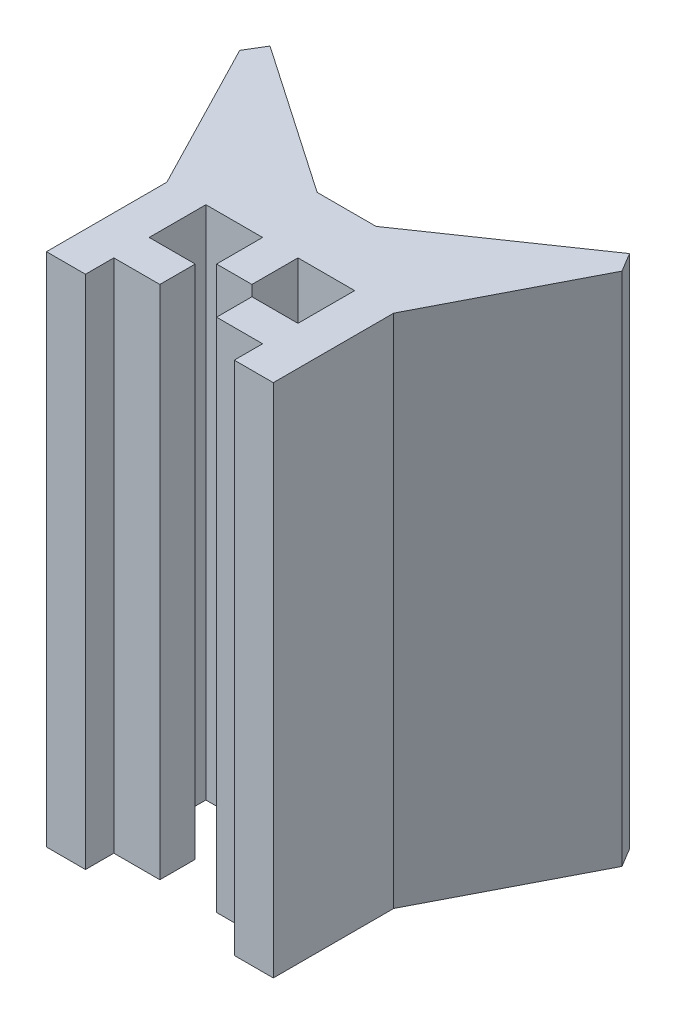
ISO-10303-21;
HEADER;
FILE_DESCRIPTION(('STEP AP214'),'2;1');
FILE_NAME('part.step','',(''),(''),'','','');
FILE_SCHEMA(('AUTOMOTIVE_DESIGN { 1 0 10303 214 1 1 1 1 }'));
ENDSEC;
DATA;
#1=APPLICATION_CONTEXT('core data for automotive mechanical design processes');
#2=APPLICATION_PROTOCOL_DEFINITION('international standard','automotive_design',2000,#1);
#3=PRODUCT_CONTEXT('',#1,'mechanical');
#4=PRODUCT('Part','Part','',(#3));
#5=PRODUCT_RELATED_PRODUCT_CATEGORY('part','',(#4));
#6=PRODUCT_DEFINITION_FORMATION('','',#4);
#7=PRODUCT_DEFINITION_CONTEXT('part definition',#1,'design');
#8=PRODUCT_DEFINITION('design','',#6,#7);
#9=PRODUCT_DEFINITION_SHAPE('','',#8);
#10=(LENGTH_UNIT() NAMED_UNIT(*) SI_UNIT(.MILLI.,.METRE.));
#11=(NAMED_UNIT(*) PLANE_ANGLE_UNIT() SI_UNIT($,.RADIAN.));
#12=(NAMED_UNIT(*) SI_UNIT($,.STERADIAN.) SOLID_ANGLE_UNIT());
#13=UNCERTAINTY_MEASURE_WITH_UNIT(LENGTH_MEASURE(1.E-05),#10,'distance_accuracy_value','');
#14=(GEOMETRIC_REPRESENTATION_CONTEXT(3) GLOBAL_UNCERTAINTY_ASSIGNED_CONTEXT((#13)) GLOBAL_UNIT_ASSIGNED_CONTEXT((#10,
#11,#12)) REPRESENTATION_CONTEXT('',''));
#15=CARTESIAN_POINT('',(0.,0.,0.));
#16=DIRECTION('',(0.,0.,1.));
#17=DIRECTION('',(1.,0.,0.));
#18=AXIS2_PLACEMENT_3D('',#15,#16,#17);
#19=CARTESIAN_POINT('',(24.4074913085997,70.,-33.1124240296466));
#20=DIRECTION('',(0.857587298496506,0.,-0.514338434746485));
#21=DIRECTION('',(-0.514338434746485,0.,-0.857587298496506));
#22=AXIS2_PLACEMENT_3D('',#19,#20,#21);
#23=PLANE('',#22);
#24=DIRECTION('',(0.514338434746485,0.,0.857587298496506));
#25=VECTOR('',#24,1.);
#26=CARTESIAN_POINT('',(24.4074913085997,0.,-33.1124240296466));
#27=LINE('',#26,#25);
#28=CARTESIAN_POINT('',(24.4074913085997,0.,-33.1124240296466));
#29=VERTEX_POINT('',#28);
#30=CARTESIAN_POINT('',(25.9505066128391,0.,-30.5396621341571));
#31=VERTEX_POINT('',#30);
#32=EDGE_CURVE('E238',#29,#31,#27,.T.);
#33=ORIENTED_EDGE('',*,*,#32,.F.);
#34=DIRECTION('',(0.,-1.,0.));
#35=VECTOR('',#34,1.);
#36=CARTESIAN_POINT('',(24.4074913085997,70.,-33.1124240296466));
#37=LINE('',#36,#35);
#38=CARTESIAN_POINT('',(24.4074913085997,70.,-33.1124240296466));
#39=VERTEX_POINT('',#38);
#40=EDGE_CURVE('E11',#39,#29,#37,.T.);
#41=ORIENTED_EDGE('',*,*,#40,.F.);
#42=DIRECTION('',(0.514338434746485,0.,0.857587298496506));
#43=VECTOR('',#42,1.);
#44=CARTESIAN_POINT('',(24.4074913085997,70.,-33.1124240296466));
#45=LINE('',#44,#43);
#46=CARTESIAN_POINT('',(25.9505066128391,70.,-30.5396621341571));
#47=VERTEX_POINT('',#46);
#48=EDGE_CURVE('E301',#39,#47,#45,.T.);
#49=ORIENTED_EDGE('',*,*,#48,.T.);
#50=DIRECTION('',(0.,-1.,0.));
#51=VECTOR('',#50,1.);
#52=CARTESIAN_POINT('',(25.9505066128391,70.,-30.5396621341571));
#53=LINE('',#52,#51);
#54=EDGE_CURVE('E35',#47,#31,#53,.T.);
#55=ORIENTED_EDGE('',*,*,#54,.T.);
#56=EDGE_LOOP('',(#33,#41,#49,#55));
#57=FACE_BOUND('',#56,.T.);
#58=ADVANCED_FACE('F32',(#57),#23,.T.);
#59=CARTESIAN_POINT('',(24.4074913085997,70.,-33.1124240296466));
#60=DIRECTION('',(0.56598003544509,0.,0.824418946578483));
#61=DIRECTION('',(0.824418946578483,0.,-0.56598003544509));
#62=AXIS2_PLACEMENT_3D('',#59,#60,#61);
#63=PLANE('',#62);
#64=DIRECTION('',(-0.824418946578483,0.,0.56598003544509));
#65=VECTOR('',#64,1.);
#66=CARTESIAN_POINT('',(24.4074913085997,0.,-33.1124240296466));
#67=LINE('',#66,#65);
#68=CARTESIAN_POINT('',(4.,0.,-19.1022745757523));
#69=VERTEX_POINT('',#68);
#70=EDGE_CURVE('E131',#29,#69,#67,.T.);
#71=ORIENTED_EDGE('',*,*,#70,.T.);
#72=DIRECTION('',(0.,-1.,0.));
#73=VECTOR('',#72,1.);
#74=CARTESIAN_POINT('',(4.,70.,-19.1022745757523));
#75=LINE('',#74,#73);
#76=CARTESIAN_POINT('',(4.,70.,-19.1022745757523));
#77=VERTEX_POINT('',#76);
#78=EDGE_CURVE('E41',#77,#69,#75,.T.);
#79=ORIENTED_EDGE('',*,*,#78,.F.);
#80=DIRECTION('',(-0.824418946578483,0.,0.56598003544509));
#81=VECTOR('',#80,1.);
#82=CARTESIAN_POINT('',(24.4074913085997,70.,-33.1124240296466));
#83=LINE('',#82,#81);
#84=EDGE_CURVE('E216',#39,#77,#83,.T.);
#85=ORIENTED_EDGE('',*,*,#84,.F.);
#86=ORIENTED_EDGE('',*,*,#40,.T.);
#87=EDGE_LOOP('',(#71,#79,#85,#86));
#88=FACE_BOUND('',#87,.T.);
#89=ADVANCED_FACE('F511',(#88),#63,.F.);
#90=CARTESIAN_POINT('',(4.,70.,-19.1022745757523));
#91=DIRECTION('',(0.,0.,1.));
#92=DIRECTION('',(1.,0.,0.));
#93=AXIS2_PLACEMENT_3D('',#90,#91,#92);
#94=PLANE('',#93);
#95=DIRECTION('',(-1.,0.,0.));
#96=VECTOR('',#95,1.);
#97=CARTESIAN_POINT('',(4.,0.,-19.1022745757523));
#98=LINE('',#97,#96);
#99=CARTESIAN_POINT('',(-4.,0.,-19.1022745757523));
#100=VERTEX_POINT('',#99);
#101=EDGE_CURVE('E223',#69,#100,#98,.T.);
#102=ORIENTED_EDGE('',*,*,#101,.T.);
#103=DIRECTION('',(0.,-1.,0.));
#104=VECTOR('',#103,1.);
#105=CARTESIAN_POINT('',(-4.,70.,-19.1022745757523));
#106=LINE('',#105,#104);
#107=CARTESIAN_POINT('',(-4.,70.,-19.1022745757523));
#108=VERTEX_POINT('',#107);
#109=EDGE_CURVE('E220',#108,#100,#106,.T.);
#110=ORIENTED_EDGE('',*,*,#109,.F.);
#111=DIRECTION('',(-1.,0.,0.));
#112=VECTOR('',#111,1.);
#113=CARTESIAN_POINT('',(4.,70.,-19.1022745757523));
#114=LINE('',#113,#112);
#115=EDGE_CURVE('E210',#77,#108,#114,.T.);
#116=ORIENTED_EDGE('',*,*,#115,.F.);
#117=ORIENTED_EDGE('',*,*,#78,.T.);
#118=EDGE_LOOP('',(#102,#110,#116,#117));
#119=FACE_BOUND('',#118,.T.);
#120=ADVANCED_FACE('F221',(#119),#94,.F.);
#121=CARTESIAN_POINT('',(-24.4074913085997,70.,-33.1124240296466));
#122=DIRECTION('',(0.56598003544509,0.,-0.824418946578483));
#123=DIRECTION('',(-0.824418946578483,0.,-0.56598003544509));
#124=AXIS2_PLACEMENT_3D('',#121,#122,#123);
#125=PLANE('',#124);
#126=DIRECTION('',(0.824418946578483,0.,0.56598003544509));
#127=VECTOR('',#126,1.);
#128=CARTESIAN_POINT('',(-24.4074913085997,0.,-33.1124240296466));
#129=LINE('',#128,#127);
#130=CARTESIAN_POINT('',(-24.4074913085997,0.,-33.1124240296466));
#131=VERTEX_POINT('',#130);
#132=EDGE_CURVE('E298',#131,#100,#129,.T.);
#133=ORIENTED_EDGE('',*,*,#132,.F.);
#134=DIRECTION('',(0.,-1.,0.));
#135=VECTOR('',#134,1.);
#136=CARTESIAN_POINT('',(-24.4074913085997,70.,-33.1124240296466));
#137=LINE('',#136,#135);
#138=CARTESIAN_POINT('',(-24.4074913085997,70.,-33.1124240296466));
#139=VERTEX_POINT('',#138);
#140=EDGE_CURVE('E227',#139,#131,#137,.T.);
#141=ORIENTED_EDGE('',*,*,#140,.F.);
#142=DIRECTION('',(0.824418946578483,0.,0.56598003544509));
#143=VECTOR('',#142,1.);
#144=CARTESIAN_POINT('',(-24.4074913085997,70.,-33.1124240296466));
#145=LINE('',#144,#143);
#146=EDGE_CURVE('E215',#139,#108,#145,.T.);
#147=ORIENTED_EDGE('',*,*,#146,.T.);
#148=ORIENTED_EDGE('',*,*,#109,.T.);
#149=EDGE_LOOP('',(#133,#141,#147,#148));
#150=FACE_BOUND('',#149,.T.);
#151=ADVANCED_FACE('F229',(#150),#125,.T.);
#152=CARTESIAN_POINT('',(-24.4074913085997,70.,-33.1124240296466));
#153=DIRECTION('',(0.857587298496506,0.,0.514338434746486));
#154=DIRECTION('',(0.514338434746486,0.,-0.857587298496506));
#155=AXIS2_PLACEMENT_3D('',#152,#153,#154);
#156=PLANE('',#155);
#157=DIRECTION('',(-0.514338434746486,0.,0.857587298496506));
#158=VECTOR('',#157,1.);
#159=CARTESIAN_POINT('',(-24.4074913085997,0.,-33.1124240296466));
#160=LINE('',#159,#158);
#161=CARTESIAN_POINT('',(-25.9505066128391,0.,-30.5396621341571));
#162=VERTEX_POINT('',#161);
#163=EDGE_CURVE('E296',#131,#162,#160,.T.);
#164=ORIENTED_EDGE('',*,*,#163,.T.);
#165=DIRECTION('',(0.,-1.,0.));
#166=VECTOR('',#165,1.);
#167=CARTESIAN_POINT('',(-25.9505066128391,70.,-30.5396621341571));
#168=LINE('',#167,#166);
#169=CARTESIAN_POINT('',(-25.9505066128391,70.,-30.5396621341571));
#170=VERTEX_POINT('',#169);
#171=EDGE_CURVE('E305',#170,#162,#168,.T.);
#172=ORIENTED_EDGE('',*,*,#171,.F.);
#173=DIRECTION('',(-0.514338434746486,0.,0.857587298496506));
#174=VECTOR('',#173,1.);
#175=CARTESIAN_POINT('',(-24.4074913085997,70.,-33.1124240296466));
#176=LINE('',#175,#174);
#177=EDGE_CURVE('E231',#139,#170,#176,.T.);
#178=ORIENTED_EDGE('',*,*,#177,.F.);
#179=ORIENTED_EDGE('',*,*,#140,.T.);
#180=EDGE_LOOP('',(#164,#172,#178,#179));
#181=FACE_BOUND('',#180,.T.);
#182=ADVANCED_FACE('F363',(#181),#156,.F.);
#183=CARTESIAN_POINT('',(-25.9505066128391,70.,-30.5396621341571));
#184=DIRECTION('',(0.888582067756729,0.,-0.458717678819093));
#185=DIRECTION('',(-0.458717678819093,0.,-0.888582067756729));
#186=AXIS2_PLACEMENT_3D('',#183,#184,#185);
#187=PLANE('',#186);
#188=DIRECTION('',(0.458717678819093,0.,0.888582067756728));
#189=VECTOR('',#188,1.);
#190=CARTESIAN_POINT('',(-25.9505066128391,0.,-30.5396621341571));
#191=LINE('',#190,#189);
#192=CARTESIAN_POINT('',(-15.4,0.,-10.1022745757523));
#193=VERTEX_POINT('',#192);
#194=EDGE_CURVE('E294',#162,#193,#191,.T.);
#195=ORIENTED_EDGE('',*,*,#194,.T.);
#196=DIRECTION('',(0.,-1.,0.));
#197=VECTOR('',#196,1.);
#198=CARTESIAN_POINT('',(-15.4,70.,-10.1022745757523));
#199=LINE('',#198,#197);
#200=CARTESIAN_POINT('',(-15.4,70.,-10.1022745757523));
#201=VERTEX_POINT('',#200);
#202=EDGE_CURVE('E308',#201,#193,#199,.T.);
#203=ORIENTED_EDGE('',*,*,#202,.F.);
#204=DIRECTION('',(0.458717678819093,0.,0.888582067756728));
#205=VECTOR('',#204,1.);
#206=CARTESIAN_POINT('',(-25.9505066128391,70.,-30.5396621341571));
#207=LINE('',#206,#205);
#208=EDGE_CURVE('E233',#170,#201,#207,.T.);
#209=ORIENTED_EDGE('',*,*,#208,.F.);
#210=ORIENTED_EDGE('',*,*,#171,.T.);
#211=EDGE_LOOP('',(#195,#203,#209,#210));
#212=FACE_BOUND('',#211,.T.);
#213=ADVANCED_FACE('F366',(#212),#187,.F.);
#214=CARTESIAN_POINT('',(-15.4,70.,-10.1022745757523));
#215=DIRECTION('',(1.,0.,0.));
#216=DIRECTION('',(0.,0.,-1.));
#217=AXIS2_PLACEMENT_3D('',#214,#215,#216);
#218=PLANE('',#217);
#219=DIRECTION('',(0.,0.,1.));
#220=VECTOR('',#219,1.);
#221=CARTESIAN_POINT('',(-15.4,0.,-10.1022745757523));
#222=LINE('',#221,#220);
#223=CARTESIAN_POINT('',(-15.4,0.,6.24772542424769));
#224=VERTEX_POINT('',#223);
#225=EDGE_CURVE('E291',#193,#224,#222,.T.);
#226=ORIENTED_EDGE('',*,*,#225,.T.);
#227=DIRECTION('',(0.,-1.,0.));
#228=VECTOR('',#227,1.);
#229=CARTESIAN_POINT('',(-15.4,70.,6.24772542424769));
#230=LINE('',#229,#228);
#231=CARTESIAN_POINT('',(-15.4,70.,6.24772542424769));
#232=VERTEX_POINT('',#231);
#233=EDGE_CURVE('E311',#232,#224,#230,.T.);
#234=ORIENTED_EDGE('',*,*,#233,.F.);
#235=DIRECTION('',(0.,0.,1.));
#236=VECTOR('',#235,1.);
#237=CARTESIAN_POINT('',(-15.4,70.,-10.1022745757523));
#238=LINE('',#237,#236);
#239=EDGE_CURVE('E369',#201,#232,#238,.T.);
#240=ORIENTED_EDGE('',*,*,#239,.F.);
#241=ORIENTED_EDGE('',*,*,#202,.T.);
#242=EDGE_LOOP('',(#226,#234,#240,#241));
#243=FACE_BOUND('',#242,.T.);
#244=ADVANCED_FACE('F501',(#243),#218,.F.);
#245=CARTESIAN_POINT('',(-10.1,70.,6.24772542424769));
#246=DIRECTION('',(0.,0.,1.));
#247=DIRECTION('',(1.,0.,0.));
#248=AXIS2_PLACEMENT_3D('',#245,#246,#247);
#249=PLANE('',#248);
#250=DIRECTION('',(-1.,0.,0.));
#251=VECTOR('',#250,1.);
#252=CARTESIAN_POINT('',(-10.1,0.,6.24772542424769));
#253=LINE('',#252,#251);
#254=CARTESIAN_POINT('',(-10.1,0.,6.24772542424769));
#255=VERTEX_POINT('',#254);
#256=EDGE_CURVE('E288',#255,#224,#253,.T.);
#257=ORIENTED_EDGE('',*,*,#256,.F.);
#258=DIRECTION('',(0.,-1.,0.));
#259=VECTOR('',#258,1.);
#260=CARTESIAN_POINT('',(-10.1,70.,6.24772542424769));
#261=LINE('',#260,#259);
#262=CARTESIAN_POINT('',(-10.1,70.,6.24772542424769));
#263=VERTEX_POINT('',#262);
#264=EDGE_CURVE('E313',#263,#255,#261,.T.);
#265=ORIENTED_EDGE('',*,*,#264,.F.);
#266=DIRECTION('',(-1.,0.,0.));
#267=VECTOR('',#266,1.);
#268=CARTESIAN_POINT('',(-10.1,70.,6.24772542424769));
#269=LINE('',#268,#267);
#270=EDGE_CURVE('E370',#263,#232,#269,.T.);
#271=ORIENTED_EDGE('',*,*,#270,.T.);
#272=ORIENTED_EDGE('',*,*,#233,.T.);
#273=EDGE_LOOP('',(#257,#265,#271,#272));
#274=FACE_BOUND('',#273,.T.);
#275=ADVANCED_FACE('F497',(#274),#249,.T.);
#276=CARTESIAN_POINT('',(-10.1,70.,2.4));
#277=DIRECTION('',(1.,0.,0.));
#278=DIRECTION('',(0.,0.,-1.));
#279=AXIS2_PLACEMENT_3D('',#276,#277,#278);
#280=PLANE('',#279);
#281=DIRECTION('',(0.,0.,1.));
#282=VECTOR('',#281,1.);
#283=CARTESIAN_POINT('',(-10.1,0.,2.4));
#284=LINE('',#283,#282);
#285=CARTESIAN_POINT('',(-10.1,0.,2.4));
#286=VERTEX_POINT('',#285);
#287=EDGE_CURVE('E285',#286,#255,#284,.T.);
#288=ORIENTED_EDGE('',*,*,#287,.F.);
#289=DIRECTION('',(0.,-1.,0.));
#290=VECTOR('',#289,1.);
#291=CARTESIAN_POINT('',(-10.1,70.,2.4));
#292=LINE('',#291,#290);
#293=CARTESIAN_POINT('',(-10.1,70.,2.4));
#294=VERTEX_POINT('',#293);
#295=EDGE_CURVE('E315',#294,#286,#292,.T.);
#296=ORIENTED_EDGE('',*,*,#295,.F.);
#297=DIRECTION('',(0.,0.,1.));
#298=VECTOR('',#297,1.);
#299=CARTESIAN_POINT('',(-10.1,70.,2.4));
#300=LINE('',#299,#298);
#301=EDGE_CURVE('E375',#294,#263,#300,.T.);
#302=ORIENTED_EDGE('',*,*,#301,.T.);
#303=ORIENTED_EDGE('',*,*,#264,.T.);
#304=EDGE_LOOP('',(#288,#296,#302,#303));
#305=FACE_BOUND('',#304,.T.);
#306=ADVANCED_FACE('F494',(#305),#280,.T.);
#307=CARTESIAN_POINT('',(-3.85,70.,2.4));
#308=DIRECTION('',(0.,0.,1.));
#309=DIRECTION('',(1.,0.,0.));
#310=AXIS2_PLACEMENT_3D('',#307,#308,#309);
#311=PLANE('',#310);
#312=DIRECTION('',(-1.,0.,0.));
#313=VECTOR('',#312,1.);
#314=CARTESIAN_POINT('',(-3.85,0.,2.4));
#315=LINE('',#314,#313);
#316=CARTESIAN_POINT('',(-3.85,0.,2.4));
#317=VERTEX_POINT('',#316);
#318=EDGE_CURVE('E282',#317,#286,#315,.T.);
#319=ORIENTED_EDGE('',*,*,#318,.F.);
#320=DIRECTION('',(0.,-1.,0.));
#321=VECTOR('',#320,1.);
#322=CARTESIAN_POINT('',(-3.85,70.,2.4));
#323=LINE('',#322,#321);
#324=CARTESIAN_POINT('',(-3.85,70.,2.4));
#325=VERTEX_POINT('',#324);
#326=EDGE_CURVE('E317',#325,#317,#323,.T.);
#327=ORIENTED_EDGE('',*,*,#326,.F.);
#328=DIRECTION('',(-1.,0.,0.));
#329=VECTOR('',#328,1.);
#330=CARTESIAN_POINT('',(-3.85,70.,2.4));
#331=LINE('',#330,#329);
#332=EDGE_CURVE('E378',#325,#294,#331,.T.);
#333=ORIENTED_EDGE('',*,*,#332,.T.);
#334=ORIENTED_EDGE('',*,*,#295,.T.);
#335=EDGE_LOOP('',(#319,#327,#333,#334));
#336=FACE_BOUND('',#335,.T.);
#337=ADVANCED_FACE('F490',(#336),#311,.T.);
#338=CARTESIAN_POINT('',(-3.85,70.,2.4));
#339=DIRECTION('',(-1.,0.,0.));
#340=DIRECTION('',(0.,0.,1.));
#341=AXIS2_PLACEMENT_3D('',#338,#339,#340);
#342=PLANE('',#341);
#343=DIRECTION('',(0.,0.,-1.));
#344=VECTOR('',#343,1.);
#345=CARTESIAN_POINT('',(-3.85,0.,2.4));
#346=LINE('',#345,#344);
#347=CARTESIAN_POINT('',(-3.85,0.,-2.4));
#348=VERTEX_POINT('',#347);
#349=EDGE_CURVE('E280',#317,#348,#346,.T.);
#350=ORIENTED_EDGE('',*,*,#349,.T.);
#351=DIRECTION('',(0.,-1.,0.));
#352=VECTOR('',#351,1.);
#353=CARTESIAN_POINT('',(-3.85,70.,-2.4));
#354=LINE('',#353,#352);
#355=CARTESIAN_POINT('',(-3.85,70.,-2.4));
#356=VERTEX_POINT('',#355);
#357=EDGE_CURVE('E319',#356,#348,#354,.T.);
#358=ORIENTED_EDGE('',*,*,#357,.F.);
#359=DIRECTION('',(0.,0.,-1.));
#360=VECTOR('',#359,1.);
#361=CARTESIAN_POINT('',(-3.85,70.,2.4));
#362=LINE('',#361,#360);
#363=EDGE_CURVE('E381',#325,#356,#362,.T.);
#364=ORIENTED_EDGE('',*,*,#363,.F.);
#365=ORIENTED_EDGE('',*,*,#326,.T.);
#366=EDGE_LOOP('',(#350,#358,#364,#365));
#367=FACE_BOUND('',#366,.T.);
#368=ADVANCED_FACE('F486',(#367),#342,.F.);
#369=CARTESIAN_POINT('',(-3.85,70.,-2.4));
#370=DIRECTION('',(0.,0.,1.));
#371=DIRECTION('',(1.,0.,0.));
#372=AXIS2_PLACEMENT_3D('',#369,#370,#371);
#373=PLANE('',#372);
#374=DIRECTION('',(-1.,0.,0.));
#375=VECTOR('',#374,1.);
#376=CARTESIAN_POINT('',(-3.85,0.,-2.4));
#377=LINE('',#376,#375);
#378=CARTESIAN_POINT('',(-10.1,0.,-2.4));
#379=VERTEX_POINT('',#378);
#380=EDGE_CURVE('E278',#348,#379,#377,.T.);
#381=ORIENTED_EDGE('',*,*,#380,.T.);
#382=DIRECTION('',(0.,-1.,0.));
#383=VECTOR('',#382,1.);
#384=CARTESIAN_POINT('',(-10.1,70.,-2.4));
#385=LINE('',#384,#383);
#386=CARTESIAN_POINT('',(-10.1,70.,-2.4));
#387=VERTEX_POINT('',#386);
#388=EDGE_CURVE('E322',#387,#379,#385,.T.);
#389=ORIENTED_EDGE('',*,*,#388,.F.);
#390=DIRECTION('',(-1.,0.,0.));
#391=VECTOR('',#390,1.);
#392=CARTESIAN_POINT('',(-3.85,70.,-2.4));
#393=LINE('',#392,#391);
#394=EDGE_CURVE('E383',#356,#387,#393,.T.);
#395=ORIENTED_EDGE('',*,*,#394,.F.);
#396=ORIENTED_EDGE('',*,*,#357,.T.);
#397=EDGE_LOOP('',(#381,#389,#395,#396));
#398=FACE_BOUND('',#397,.T.);
#399=ADVANCED_FACE('F482',(#398),#373,.F.);
#400=CARTESIAN_POINT('',(-10.1,70.,-2.4));
#401=DIRECTION('',(-1.,0.,0.));
#402=DIRECTION('',(0.,0.,1.));
#403=AXIS2_PLACEMENT_3D('',#400,#401,#402);
#404=PLANE('',#403);
#405=DIRECTION('',(0.,0.,-1.));
#406=VECTOR('',#405,1.);
#407=CARTESIAN_POINT('',(-10.1,0.,-2.4));
#408=LINE('',#407,#406);
#409=CARTESIAN_POINT('',(-10.1,0.,-10.1));
#410=VERTEX_POINT('',#409);
#411=EDGE_CURVE('E276',#379,#410,#408,.T.);
#412=ORIENTED_EDGE('',*,*,#411,.T.);
#413=DIRECTION('',(0.,-1.,0.));
#414=VECTOR('',#413,1.);
#415=CARTESIAN_POINT('',(-10.1,70.,-10.1));
#416=LINE('',#415,#414);
#417=CARTESIAN_POINT('',(-10.1,70.,-10.1));
#418=VERTEX_POINT('',#417);
#419=EDGE_CURVE('E325',#418,#410,#416,.T.);
#420=ORIENTED_EDGE('',*,*,#419,.F.);
#421=DIRECTION('',(0.,0.,-1.));
#422=VECTOR('',#421,1.);
#423=CARTESIAN_POINT('',(-10.1,70.,-2.4));
#424=LINE('',#423,#422);
#425=EDGE_CURVE('E385',#387,#418,#424,.T.);
#426=ORIENTED_EDGE('',*,*,#425,.F.);
#427=ORIENTED_EDGE('',*,*,#388,.T.);
#428=EDGE_LOOP('',(#412,#420,#426,#427));
#429=FACE_BOUND('',#428,.T.);
#430=ADVANCED_FACE('F477',(#429),#404,.F.);
#431=CARTESIAN_POINT('',(-10.1,70.,-10.1));
#432=DIRECTION('',(0.,0.,-1.));
#433=DIRECTION('',(-1.,0.,0.));
#434=AXIS2_PLACEMENT_3D('',#431,#432,#433);
#435=PLANE('',#434);
#436=DIRECTION('',(1.,0.,0.));
#437=VECTOR('',#436,1.);
#438=CARTESIAN_POINT('',(-10.1,0.,-10.1));
#439=LINE('',#438,#437);
#440=CARTESIAN_POINT('',(-2.4,0.,-10.1));
#441=VERTEX_POINT('',#440);
#442=EDGE_CURVE('E274',#410,#441,#439,.T.);
#443=ORIENTED_EDGE('',*,*,#442,.T.);
#444=DIRECTION('',(0.,-1.,0.));
#445=VECTOR('',#444,1.);
#446=CARTESIAN_POINT('',(-2.4,70.,-10.1));
#447=LINE('',#446,#445);
#448=CARTESIAN_POINT('',(-2.4,70.,-10.1));
#449=VERTEX_POINT('',#448);
#450=EDGE_CURVE('E328',#449,#441,#447,.T.);
#451=ORIENTED_EDGE('',*,*,#450,.F.);
#452=DIRECTION('',(1.,0.,0.));
#453=VECTOR('',#452,1.);
#454=CARTESIAN_POINT('',(-10.1,70.,-10.1));
#455=LINE('',#454,#453);
#456=EDGE_CURVE('E387',#418,#449,#455,.T.);
#457=ORIENTED_EDGE('',*,*,#456,.F.);
#458=ORIENTED_EDGE('',*,*,#419,.T.);
#459=EDGE_LOOP('',(#443,#451,#457,#458));
#460=FACE_BOUND('',#459,.T.);
#461=ADVANCED_FACE('F471',(#460),#435,.F.);
#462=CARTESIAN_POINT('',(-2.4,70.,-10.1));
#463=DIRECTION('',(1.,0.,0.));
#464=DIRECTION('',(0.,0.,-1.));
#465=AXIS2_PLACEMENT_3D('',#462,#463,#464);
#466=PLANE('',#465);
#467=DIRECTION('',(0.,0.,1.));
#468=VECTOR('',#467,1.);
#469=CARTESIAN_POINT('',(-2.4,0.,-10.1));
#470=LINE('',#469,#468);
#471=CARTESIAN_POINT('',(-2.4,0.,-3.85));
#472=VERTEX_POINT('',#471);
#473=EDGE_CURVE('E272',#441,#472,#470,.T.);
#474=ORIENTED_EDGE('',*,*,#473,.T.);
#475=DIRECTION('',(0.,-1.,0.));
#476=VECTOR('',#475,1.);
#477=CARTESIAN_POINT('',(-2.4,70.,-3.85));
#478=LINE('',#477,#476);
#479=CARTESIAN_POINT('',(-2.4,70.,-3.85));
#480=VERTEX_POINT('',#479);
#481=EDGE_CURVE('E331',#480,#472,#478,.T.);
#482=ORIENTED_EDGE('',*,*,#481,.F.);
#483=DIRECTION('',(0.,0.,1.));
#484=VECTOR('',#483,1.);
#485=CARTESIAN_POINT('',(-2.4,70.,-10.1));
#486=LINE('',#485,#484);
#487=EDGE_CURVE('E389',#449,#480,#486,.T.);
#488=ORIENTED_EDGE('',*,*,#487,.F.);
#489=ORIENTED_EDGE('',*,*,#450,.T.);
#490=EDGE_LOOP('',(#474,#482,#488,#489));
#491=FACE_BOUND('',#490,.T.);
#492=ADVANCED_FACE('F467',(#491),#466,.F.);
#493=CARTESIAN_POINT('',(-2.4,70.,-3.85));
#494=DIRECTION('',(0.,0.,-1.));
#495=DIRECTION('',(-1.,0.,0.));
#496=AXIS2_PLACEMENT_3D('',#493,#494,#495);
#497=PLANE('',#496);
#498=DIRECTION('',(1.,0.,0.));
#499=VECTOR('',#498,1.);
#500=CARTESIAN_POINT('',(-2.4,0.,-3.85));
#501=LINE('',#500,#499);
#502=CARTESIAN_POINT('',(2.4,0.,-3.85));
#503=VERTEX_POINT('',#502);
#504=EDGE_CURVE('E269',#472,#503,#501,.T.);
#505=ORIENTED_EDGE('',*,*,#504,.T.);
#506=DIRECTION('',(0.,-1.,0.));
#507=VECTOR('',#506,1.);
#508=CARTESIAN_POINT('',(2.4,70.,-3.85));
#509=LINE('',#508,#507);
#510=CARTESIAN_POINT('',(2.4,70.,-3.85));
#511=VERTEX_POINT('',#510);
#512=EDGE_CURVE('E334',#511,#503,#509,.T.);
#513=ORIENTED_EDGE('',*,*,#512,.F.);
#514=DIRECTION('',(1.,0.,0.));
#515=VECTOR('',#514,1.);
#516=CARTESIAN_POINT('',(-2.4,70.,-3.85));
#517=LINE('',#516,#515);
#518=EDGE_CURVE('E391',#480,#511,#517,.T.);
#519=ORIENTED_EDGE('',*,*,#518,.F.);
#520=ORIENTED_EDGE('',*,*,#481,.T.);
#521=EDGE_LOOP('',(#505,#513,#519,#520));
#522=FACE_BOUND('',#521,.T.);
#523=ADVANCED_FACE('F462',(#522),#497,.F.);
#524=CARTESIAN_POINT('',(2.4,70.,-10.1));
#525=DIRECTION('',(1.,0.,0.));
#526=DIRECTION('',(0.,0.,-1.));
#527=AXIS2_PLACEMENT_3D('',#524,#525,#526);
#528=PLANE('',#527);
#529=DIRECTION('',(0.,0.,1.));
#530=VECTOR('',#529,1.);
#531=CARTESIAN_POINT('',(2.4,0.,-10.1));
#532=LINE('',#531,#530);
#533=CARTESIAN_POINT('',(2.4,0.,-10.1));
#534=VERTEX_POINT('',#533);
#535=EDGE_CURVE('E266',#534,#503,#532,.T.);
#536=ORIENTED_EDGE('',*,*,#535,.F.);
#537=DIRECTION('',(0.,-1.,0.));
#538=VECTOR('',#537,1.);
#539=CARTESIAN_POINT('',(2.4,70.,-10.1));
#540=LINE('',#539,#538);
#541=CARTESIAN_POINT('',(2.4,70.,-10.1));
#542=VERTEX_POINT('',#541);
#543=EDGE_CURVE('E336',#542,#534,#540,.T.);
#544=ORIENTED_EDGE('',*,*,#543,.F.);
#545=DIRECTION('',(0.,0.,1.));
#546=VECTOR('',#545,1.);
#547=CARTESIAN_POINT('',(2.4,70.,-10.1));
#548=LINE('',#547,#546);
#549=EDGE_CURVE('E393',#542,#511,#548,.T.);
#550=ORIENTED_EDGE('',*,*,#549,.T.);
#551=ORIENTED_EDGE('',*,*,#512,.T.);
#552=EDGE_LOOP('',(#536,#544,#550,#551));
#553=FACE_BOUND('',#552,.T.);
#554=ADVANCED_FACE('F456',(#553),#528,.T.);
#555=CARTESIAN_POINT('',(10.1,70.,-10.1));
#556=DIRECTION('',(0.,0.,1.));
#557=DIRECTION('',(1.,0.,0.));
#558=AXIS2_PLACEMENT_3D('',#555,#556,#557);
#559=PLANE('',#558);
#560=DIRECTION('',(-1.,0.,0.));
#561=VECTOR('',#560,1.);
#562=CARTESIAN_POINT('',(10.1,0.,-10.1));
#563=LINE('',#562,#561);
#564=CARTESIAN_POINT('',(10.1,0.,-10.1));
#565=VERTEX_POINT('',#564);
#566=EDGE_CURVE('E263',#565,#534,#563,.T.);
#567=ORIENTED_EDGE('',*,*,#566,.F.);
#568=DIRECTION('',(0.,-1.,0.));
#569=VECTOR('',#568,1.);
#570=CARTESIAN_POINT('',(10.1,70.,-10.1));
#571=LINE('',#570,#569);
#572=CARTESIAN_POINT('',(10.1,70.,-10.1));
#573=VERTEX_POINT('',#572);
#574=EDGE_CURVE('E338',#573,#565,#571,.T.);
#575=ORIENTED_EDGE('',*,*,#574,.F.);
#576=DIRECTION('',(-1.,0.,0.));
#577=VECTOR('',#576,1.);
#578=CARTESIAN_POINT('',(10.1,70.,-10.1));
#579=LINE('',#578,#577);
#580=EDGE_CURVE('E396',#573,#542,#579,.T.);
#581=ORIENTED_EDGE('',*,*,#580,.T.);
#582=ORIENTED_EDGE('',*,*,#543,.T.);
#583=EDGE_LOOP('',(#567,#575,#581,#582));
#584=FACE_BOUND('',#583,.T.);
#585=ADVANCED_FACE('F452',(#584),#559,.T.);
#586=CARTESIAN_POINT('',(10.1,70.,-2.4));
#587=DIRECTION('',(-1.,0.,0.));
#588=DIRECTION('',(0.,0.,1.));
#589=AXIS2_PLACEMENT_3D('',#586,#587,#588);
#590=PLANE('',#589);
#591=DIRECTION('',(0.,0.,-1.));
#592=VECTOR('',#591,1.);
#593=CARTESIAN_POINT('',(10.1,0.,-2.4));
#594=LINE('',#593,#592);
#595=CARTESIAN_POINT('',(10.1,0.,-2.4));
#596=VERTEX_POINT('',#595);
#597=EDGE_CURVE('E260',#596,#565,#594,.T.);
#598=ORIENTED_EDGE('',*,*,#597,.F.);
#599=DIRECTION('',(0.,-1.,0.));
#600=VECTOR('',#599,1.);
#601=CARTESIAN_POINT('',(10.1,70.,-2.4));
#602=LINE('',#601,#600);
#603=CARTESIAN_POINT('',(10.1,70.,-2.4));
#604=VERTEX_POINT('',#603);
#605=EDGE_CURVE('E340',#604,#596,#602,.T.);
#606=ORIENTED_EDGE('',*,*,#605,.F.);
#607=DIRECTION('',(0.,0.,-1.));
#608=VECTOR('',#607,1.);
#609=CARTESIAN_POINT('',(10.1,70.,-2.4));
#610=LINE('',#609,#608);
#611=EDGE_CURVE('E399',#604,#573,#610,.T.);
#612=ORIENTED_EDGE('',*,*,#611,.T.);
#613=ORIENTED_EDGE('',*,*,#574,.T.);
#614=EDGE_LOOP('',(#598,#606,#612,#613));
#615=FACE_BOUND('',#614,.T.);
#616=ADVANCED_FACE('F448',(#615),#590,.T.);
#617=CARTESIAN_POINT('',(3.85,70.,-2.4));
#618=DIRECTION('',(0.,0.,-1.));
#619=DIRECTION('',(-1.,0.,0.));
#620=AXIS2_PLACEMENT_3D('',#617,#618,#619);
#621=PLANE('',#620);
#622=DIRECTION('',(1.,0.,0.));
#623=VECTOR('',#622,1.);
#624=CARTESIAN_POINT('',(3.85,0.,-2.4));
#625=LINE('',#624,#623);
#626=CARTESIAN_POINT('',(3.85,0.,-2.4));
#627=VERTEX_POINT('',#626);
#628=EDGE_CURVE('E257',#627,#596,#625,.T.);
#629=ORIENTED_EDGE('',*,*,#628,.F.);
#630=DIRECTION('',(0.,-1.,0.));
#631=VECTOR('',#630,1.);
#632=CARTESIAN_POINT('',(3.85,70.,-2.4));
#633=LINE('',#632,#631);
#634=CARTESIAN_POINT('',(3.85,70.,-2.4));
#635=VERTEX_POINT('',#634);
#636=EDGE_CURVE('E342',#635,#627,#633,.T.);
#637=ORIENTED_EDGE('',*,*,#636,.F.);
#638=DIRECTION('',(1.,0.,0.));
#639=VECTOR('',#638,1.);
#640=CARTESIAN_POINT('',(3.85,70.,-2.4));
#641=LINE('',#640,#639);
#642=EDGE_CURVE('E402',#635,#604,#641,.T.);
#643=ORIENTED_EDGE('',*,*,#642,.T.);
#644=ORIENTED_EDGE('',*,*,#605,.T.);
#645=EDGE_LOOP('',(#629,#637,#643,#644));
#646=FACE_BOUND('',#645,.T.);
#647=ADVANCED_FACE('F444',(#646),#621,.T.);
#648=CARTESIAN_POINT('',(3.85,70.,2.4));
#649=DIRECTION('',(-1.,0.,0.));
#650=DIRECTION('',(0.,0.,1.));
#651=AXIS2_PLACEMENT_3D('',#648,#649,#650);
#652=PLANE('',#651);
#653=DIRECTION('',(0.,0.,-1.));
#654=VECTOR('',#653,1.);
#655=CARTESIAN_POINT('',(3.85,0.,2.4));
#656=LINE('',#655,#654);
#657=CARTESIAN_POINT('',(3.85,0.,2.4));
#658=VERTEX_POINT('',#657);
#659=EDGE_CURVE('E254',#658,#627,#656,.T.);
#660=ORIENTED_EDGE('',*,*,#659,.F.);
#661=DIRECTION('',(0.,-1.,0.));
#662=VECTOR('',#661,1.);
#663=CARTESIAN_POINT('',(3.85,70.,2.4));
#664=LINE('',#663,#662);
#665=CARTESIAN_POINT('',(3.85,70.,2.4));
#666=VERTEX_POINT('',#665);
#667=EDGE_CURVE('E344',#666,#658,#664,.T.);
#668=ORIENTED_EDGE('',*,*,#667,.F.);
#669=DIRECTION('',(0.,0.,-1.));
#670=VECTOR('',#669,1.);
#671=CARTESIAN_POINT('',(3.85,70.,2.4));
#672=LINE('',#671,#670);
#673=EDGE_CURVE('E405',#666,#635,#672,.T.);
#674=ORIENTED_EDGE('',*,*,#673,.T.);
#675=ORIENTED_EDGE('',*,*,#636,.T.);
#676=EDGE_LOOP('',(#660,#668,#674,#675));
#677=FACE_BOUND('',#676,.T.);
#678=ADVANCED_FACE('F440',(#677),#652,.T.);
#679=CARTESIAN_POINT('',(3.85,70.,2.4));
#680=DIRECTION('',(0.,0.,-1.));
#681=DIRECTION('',(-1.,0.,0.));
#682=AXIS2_PLACEMENT_3D('',#679,#680,#681);
#683=PLANE('',#682);
#684=DIRECTION('',(1.,0.,0.));
#685=VECTOR('',#684,1.);
#686=CARTESIAN_POINT('',(3.85,0.,2.4));
#687=LINE('',#686,#685);
#688=CARTESIAN_POINT('',(10.1,0.,2.4));
#689=VERTEX_POINT('',#688);
#690=EDGE_CURVE('E252',#658,#689,#687,.T.);
#691=ORIENTED_EDGE('',*,*,#690,.T.);
#692=DIRECTION('',(0.,-1.,0.));
#693=VECTOR('',#692,1.);
#694=CARTESIAN_POINT('',(10.1,70.,2.4));
#695=LINE('',#694,#693);
#696=CARTESIAN_POINT('',(10.1,70.,2.4));
#697=VERTEX_POINT('',#696);
#698=EDGE_CURVE('E346',#697,#689,#695,.T.);
#699=ORIENTED_EDGE('',*,*,#698,.F.);
#700=DIRECTION('',(1.,0.,0.));
#701=VECTOR('',#700,1.);
#702=CARTESIAN_POINT('',(3.85,70.,2.4));
#703=LINE('',#702,#701);
#704=EDGE_CURVE('E408',#666,#697,#703,.T.);
#705=ORIENTED_EDGE('',*,*,#704,.F.);
#706=ORIENTED_EDGE('',*,*,#667,.T.);
#707=EDGE_LOOP('',(#691,#699,#705,#706));
#708=FACE_BOUND('',#707,.T.);
#709=ADVANCED_FACE('F436',(#708),#683,.F.);
#710=CARTESIAN_POINT('',(10.1,70.,2.4));
#711=DIRECTION('',(1.,0.,0.));
#712=DIRECTION('',(0.,0.,-1.));
#713=AXIS2_PLACEMENT_3D('',#710,#711,#712);
#714=PLANE('',#713);
#715=DIRECTION('',(0.,0.,1.));
#716=VECTOR('',#715,1.);
#717=CARTESIAN_POINT('',(10.1,0.,2.4));
#718=LINE('',#717,#716);
#719=CARTESIAN_POINT('',(10.1,0.,6.24772542424769));
#720=VERTEX_POINT('',#719);
#721=EDGE_CURVE('E250',#689,#720,#718,.T.);
#722=ORIENTED_EDGE('',*,*,#721,.T.);
#723=DIRECTION('',(0.,-1.,0.));
#724=VECTOR('',#723,1.);
#725=CARTESIAN_POINT('',(10.1,70.,6.24772542424769));
#726=LINE('',#725,#724);
#727=CARTESIAN_POINT('',(10.1,70.,6.24772542424769));
#728=VERTEX_POINT('',#727);
#729=EDGE_CURVE('E349',#728,#720,#726,.T.);
#730=ORIENTED_EDGE('',*,*,#729,.F.);
#731=DIRECTION('',(0.,0.,1.));
#732=VECTOR('',#731,1.);
#733=CARTESIAN_POINT('',(10.1,70.,2.4));
#734=LINE('',#733,#732);
#735=EDGE_CURVE('E410',#697,#728,#734,.T.);
#736=ORIENTED_EDGE('',*,*,#735,.F.);
#737=ORIENTED_EDGE('',*,*,#698,.T.);
#738=EDGE_LOOP('',(#722,#730,#736,#737));
#739=FACE_BOUND('',#738,.T.);
#740=ADVANCED_FACE('F432',(#739),#714,.F.);
#741=CARTESIAN_POINT('',(10.1,70.,6.24772542424769));
#742=DIRECTION('',(0.,0.,-1.));
#743=DIRECTION('',(-1.,0.,0.));
#744=AXIS2_PLACEMENT_3D('',#741,#742,#743);
#745=PLANE('',#744);
#746=DIRECTION('',(1.,0.,0.));
#747=VECTOR('',#746,1.);
#748=CARTESIAN_POINT('',(10.1,0.,6.24772542424769));
#749=LINE('',#748,#747);
#750=CARTESIAN_POINT('',(15.4,0.,6.24772542424769));
#751=VERTEX_POINT('',#750);
#752=EDGE_CURVE('E247',#720,#751,#749,.T.);
#753=ORIENTED_EDGE('',*,*,#752,.T.);
#754=DIRECTION('',(0.,-1.,0.));
#755=VECTOR('',#754,1.);
#756=CARTESIAN_POINT('',(15.4,70.,6.24772542424769));
#757=LINE('',#756,#755);
#758=CARTESIAN_POINT('',(15.4,70.,6.24772542424769));
#759=VERTEX_POINT('',#758);
#760=EDGE_CURVE('E352',#759,#751,#757,.T.);
#761=ORIENTED_EDGE('',*,*,#760,.F.);
#762=DIRECTION('',(1.,0.,0.));
#763=VECTOR('',#762,1.);
#764=CARTESIAN_POINT('',(10.1,70.,6.24772542424769));
#765=LINE('',#764,#763);
#766=EDGE_CURVE('E412',#728,#759,#765,.T.);
#767=ORIENTED_EDGE('',*,*,#766,.F.);
#768=ORIENTED_EDGE('',*,*,#729,.T.);
#769=EDGE_LOOP('',(#753,#761,#767,#768));
#770=FACE_BOUND('',#769,.T.);
#771=ADVANCED_FACE('F428',(#770),#745,.F.);
#772=CARTESIAN_POINT('',(15.4,70.,-10.1022745757523));
#773=DIRECTION('',(1.,0.,0.));
#774=DIRECTION('',(0.,0.,-1.));
#775=AXIS2_PLACEMENT_3D('',#772,#773,#774);
#776=PLANE('',#775);
#777=DIRECTION('',(0.,0.,1.));
#778=VECTOR('',#777,1.);
#779=CARTESIAN_POINT('',(15.4,0.,-10.1022745757523));
#780=LINE('',#779,#778);
#781=CARTESIAN_POINT('',(15.4,0.,-10.1022745757523));
#782=VERTEX_POINT('',#781);
#783=EDGE_CURVE('E244',#782,#751,#780,.T.);
#784=ORIENTED_EDGE('',*,*,#783,.F.);
#785=DIRECTION('',(0.,-1.,0.));
#786=VECTOR('',#785,1.);
#787=CARTESIAN_POINT('',(15.4,70.,-10.1022745757523));
#788=LINE('',#787,#786);
#789=CARTESIAN_POINT('',(15.4,70.,-10.1022745757523));
#790=VERTEX_POINT('',#789);
#791=EDGE_CURVE('E353',#790,#782,#788,.T.);
#792=ORIENTED_EDGE('',*,*,#791,.F.);
#793=DIRECTION('',(0.,0.,1.));
#794=VECTOR('',#793,1.);
#795=CARTESIAN_POINT('',(15.4,70.,-10.1022745757523));
#796=LINE('',#795,#794);
#797=EDGE_CURVE('E414',#790,#759,#796,.T.);
#798=ORIENTED_EDGE('',*,*,#797,.T.);
#799=ORIENTED_EDGE('',*,*,#760,.T.);
#800=EDGE_LOOP('',(#784,#792,#798,#799));
#801=FACE_BOUND('',#800,.T.);
#802=ADVANCED_FACE('F423',(#801),#776,.T.);
#803=CARTESIAN_POINT('',(25.9505066128391,70.,-30.5396621341571));
#804=DIRECTION('',(0.888582067756729,0.,0.458717678819093));
#805=DIRECTION('',(0.458717678819093,0.,-0.888582067756729));
#806=AXIS2_PLACEMENT_3D('',#803,#804,#805);
#807=PLANE('',#806);
#808=DIRECTION('',(-0.458717678819093,0.,0.888582067756728));
#809=VECTOR('',#808,1.);
#810=CARTESIAN_POINT('',(25.9505066128391,0.,-30.5396621341571));
#811=LINE('',#810,#809);
#812=EDGE_CURVE('E241',#31,#782,#811,.T.);
#813=ORIENTED_EDGE('',*,*,#812,.F.);
#814=ORIENTED_EDGE('',*,*,#54,.F.);
#815=DIRECTION('',(-0.458717678819093,0.,0.888582067756728));
#816=VECTOR('',#815,1.);
#817=CARTESIAN_POINT('',(25.9505066128391,70.,-30.5396621341571));
#818=LINE('',#817,#816);
#819=EDGE_CURVE('E417',#47,#790,#818,.T.);
#820=ORIENTED_EDGE('',*,*,#819,.T.);
#821=ORIENTED_EDGE('',*,*,#791,.T.);
#822=EDGE_LOOP('',(#813,#814,#820,#821));
#823=FACE_BOUND('',#822,.T.);
#824=ADVANCED_FACE('F355',(#823),#807,.T.);
#825=CARTESIAN_POINT('',(0.,70.,0.));
#826=DIRECTION('',(0.,-1.,0.));
#827=DIRECTION('',(0.,0.,-1.));
#828=AXIS2_PLACEMENT_3D('',#825,#826,#827);
#829=PLANE('',#828);
#830=ORIENTED_EDGE('',*,*,#48,.F.);
#831=ORIENTED_EDGE('',*,*,#84,.T.);
#832=ORIENTED_EDGE('',*,*,#115,.T.);
#833=ORIENTED_EDGE('',*,*,#146,.F.);
#834=ORIENTED_EDGE('',*,*,#177,.T.);
#835=ORIENTED_EDGE('',*,*,#208,.T.);
#836=ORIENTED_EDGE('',*,*,#239,.T.);
#837=ORIENTED_EDGE('',*,*,#270,.F.);
#838=ORIENTED_EDGE('',*,*,#301,.F.);
#839=ORIENTED_EDGE('',*,*,#332,.F.);
#840=ORIENTED_EDGE('',*,*,#363,.T.);
#841=ORIENTED_EDGE('',*,*,#394,.T.);
#842=ORIENTED_EDGE('',*,*,#425,.T.);
#843=ORIENTED_EDGE('',*,*,#456,.T.);
#844=ORIENTED_EDGE('',*,*,#487,.T.);
#845=ORIENTED_EDGE('',*,*,#518,.T.);
#846=ORIENTED_EDGE('',*,*,#549,.F.);
#847=ORIENTED_EDGE('',*,*,#580,.F.);
#848=ORIENTED_EDGE('',*,*,#611,.F.);
#849=ORIENTED_EDGE('',*,*,#642,.F.);
#850=ORIENTED_EDGE('',*,*,#673,.F.);
#851=ORIENTED_EDGE('',*,*,#704,.T.);
#852=ORIENTED_EDGE('',*,*,#735,.T.);
#853=ORIENTED_EDGE('',*,*,#766,.T.);
#854=ORIENTED_EDGE('',*,*,#797,.F.);
#855=ORIENTED_EDGE('',*,*,#819,.F.);
#856=EDGE_LOOP('',(#830,#831,#832,#833,#834,#835,#836,#837,#838,#839,#840,#841,#842,#843,#844,
#845,#846,#847,#848,#849,#850,#851,#852,#853,#854,#855));
#857=FACE_BOUND('',#856,.T.);
#858=ADVANCED_FACE('F213',(#857),#829,.F.);
#859=CARTESIAN_POINT('',(0.,0.,0.));
#860=DIRECTION('',(0.,-1.,0.));
#861=DIRECTION('',(0.,0.,-1.));
#862=AXIS2_PLACEMENT_3D('',#859,#860,#861);
#863=PLANE('',#862);
#864=ORIENTED_EDGE('',*,*,#32,.T.);
#865=ORIENTED_EDGE('',*,*,#812,.T.);
#866=ORIENTED_EDGE('',*,*,#783,.T.);
#867=ORIENTED_EDGE('',*,*,#752,.F.);
#868=ORIENTED_EDGE('',*,*,#721,.F.);
#869=ORIENTED_EDGE('',*,*,#690,.F.);
#870=ORIENTED_EDGE('',*,*,#659,.T.);
#871=ORIENTED_EDGE('',*,*,#628,.T.);
#872=ORIENTED_EDGE('',*,*,#597,.T.);
#873=ORIENTED_EDGE('',*,*,#566,.T.);
#874=ORIENTED_EDGE('',*,*,#535,.T.);
#875=ORIENTED_EDGE('',*,*,#504,.F.);
#876=ORIENTED_EDGE('',*,*,#473,.F.);
#877=ORIENTED_EDGE('',*,*,#442,.F.);
#878=ORIENTED_EDGE('',*,*,#411,.F.);
#879=ORIENTED_EDGE('',*,*,#380,.F.);
#880=ORIENTED_EDGE('',*,*,#349,.F.);
#881=ORIENTED_EDGE('',*,*,#318,.T.);
#882=ORIENTED_EDGE('',*,*,#287,.T.);
#883=ORIENTED_EDGE('',*,*,#256,.T.);
#884=ORIENTED_EDGE('',*,*,#225,.F.);
#885=ORIENTED_EDGE('',*,*,#194,.F.);
#886=ORIENTED_EDGE('',*,*,#163,.F.);
#887=ORIENTED_EDGE('',*,*,#132,.T.);
#888=ORIENTED_EDGE('',*,*,#101,.F.);
#889=ORIENTED_EDGE('',*,*,#70,.F.);
#890=EDGE_LOOP('',(#864,#865,#866,#867,#868,#869,#870,#871,#872,#873,#874,#875,#876,#877,#878,
#879,#880,#881,#882,#883,#884,#885,#886,#887,#888,#889));
#891=FACE_BOUND('',#890,.T.);
#892=ADVANCED_FACE('F357',(#891),#863,.T.);
#893=CLOSED_SHELL('',(#58,#89,#120,#151,#182,#213,#244,#275,#306,#337,#368,#399,#430,#461,#492,
#523,#554,#585,#616,#647,#678,#709,#740,#771,#802,#824,#858,#892));
#894=MANIFOLD_SOLID_BREP('B2',#893);
#895=ADVANCED_BREP_SHAPE_REPRESENTATION('',(#18,#894),#14);
#896=SHAPE_DEFINITION_REPRESENTATION(#9,#895);
ENDSEC;
END-ISO-10303-21;
